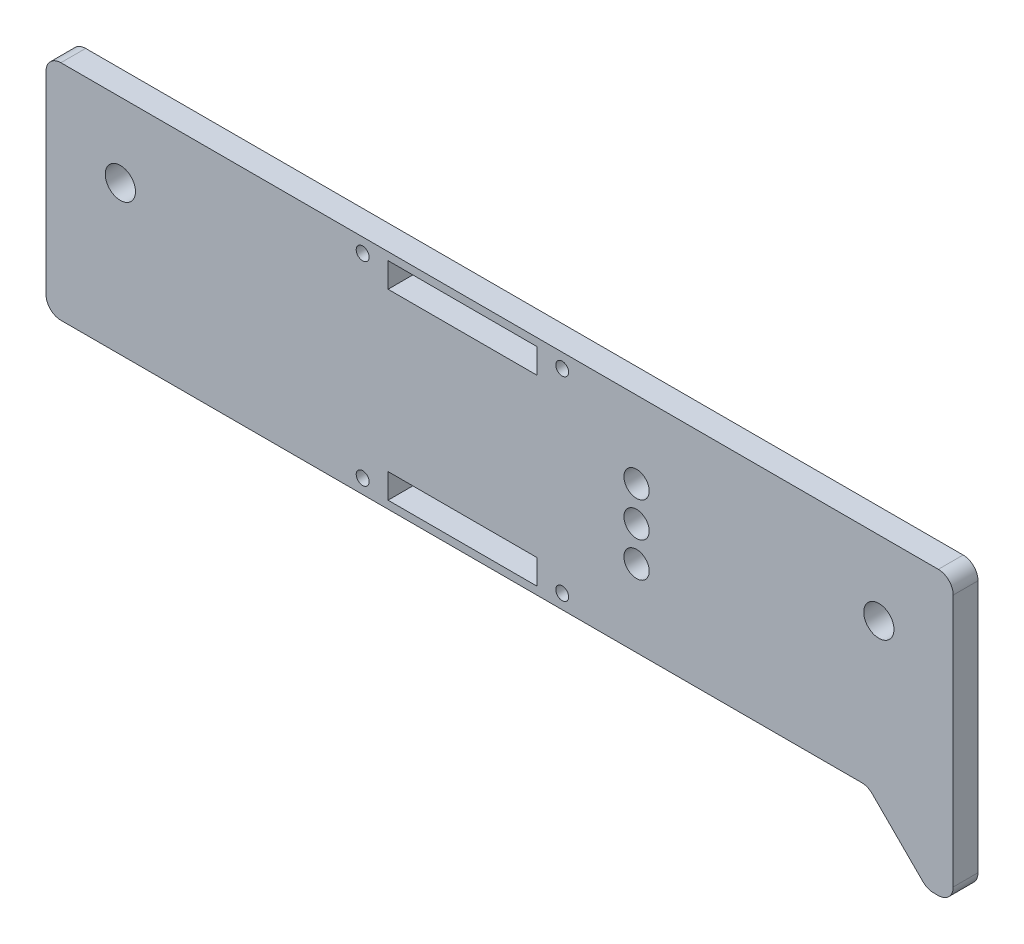
ISO-10303-21;
HEADER;
FILE_DESCRIPTION(('STEP AP214'),'2;1');
FILE_NAME('part.step','',(''),(''),'','','');
FILE_SCHEMA(('AUTOMOTIVE_DESIGN { 1 0 10303 214 1 1 1 1 }'));
ENDSEC;
DATA;
#1=APPLICATION_CONTEXT('core data for automotive mechanical design processes');
#2=APPLICATION_PROTOCOL_DEFINITION('international standard','automotive_design',2000,#1);
#3=PRODUCT_CONTEXT('',#1,'mechanical');
#4=PRODUCT('Part','Part','',(#3));
#5=PRODUCT_RELATED_PRODUCT_CATEGORY('part','',(#4));
#6=PRODUCT_DEFINITION_FORMATION('','',#4);
#7=PRODUCT_DEFINITION_CONTEXT('part definition',#1,'design');
#8=PRODUCT_DEFINITION('design','',#6,#7);
#9=PRODUCT_DEFINITION_SHAPE('','',#8);
#10=(LENGTH_UNIT() NAMED_UNIT(*) SI_UNIT(.MILLI.,.METRE.));
#11=(NAMED_UNIT(*) PLANE_ANGLE_UNIT() SI_UNIT($,.RADIAN.));
#12=(NAMED_UNIT(*) SI_UNIT($,.STERADIAN.) SOLID_ANGLE_UNIT());
#13=UNCERTAINTY_MEASURE_WITH_UNIT(LENGTH_MEASURE(1.E-05),#10,'distance_accuracy_value','');
#14=(GEOMETRIC_REPRESENTATION_CONTEXT(3) GLOBAL_UNCERTAINTY_ASSIGNED_CONTEXT((#13)) GLOBAL_UNIT_ASSIGNED_CONTEXT((#10,
#11,#12)) REPRESENTATION_CONTEXT('',''));
#15=CARTESIAN_POINT('',(0.,0.,0.));
#16=DIRECTION('',(0.,0.,1.));
#17=DIRECTION('',(1.,0.,0.));
#18=AXIS2_PLACEMENT_3D('',#15,#16,#17);
#19=CARTESIAN_POINT('',(0.,0.,5.));
#20=DIRECTION('',(0.,0.,1.));
#21=DIRECTION('',(1.,0.,0.));
#22=AXIS2_PLACEMENT_3D('',#19,#20,#21);
#23=PLANE('',#22);
#24=CARTESIAN_POINT('',(104.125,2.875,5.));
#25=DIRECTION('',(0.,0.,1.));
#26=DIRECTION('',(1.,0.,0.));
#27=AXIS2_PLACEMENT_3D('',#24,#25,#26);
#28=CIRCLE('',#27,1.30000000000001);
#29=CARTESIAN_POINT('',(105.425,2.875,5.));
#30=VERTEX_POINT('',#29);
#31=EDGE_CURVE('E250',#30,#30,#28,.T.);
#32=ORIENTED_EDGE('',*,*,#31,.F.);
#33=EDGE_LOOP('',(#32));
#34=FACE_BOUND('',#33,.T.);
#35=CARTESIAN_POINT('',(63.875,42.125,5.));
#36=DIRECTION('',(0.,0.,1.));
#37=DIRECTION('',(1.,0.,0.));
#38=AXIS2_PLACEMENT_3D('',#35,#36,#37);
#39=CIRCLE('',#38,1.29999999999999);
#40=CARTESIAN_POINT('',(65.175,42.125,5.));
#41=VERTEX_POINT('',#40);
#42=EDGE_CURVE('E262',#41,#41,#39,.T.);
#43=ORIENTED_EDGE('',*,*,#42,.F.);
#44=EDGE_LOOP('',(#43));
#45=FACE_BOUND('',#44,.T.);
#46=CARTESIAN_POINT('',(119.125,22.5,5.));
#47=DIRECTION('',(0.,0.,1.));
#48=DIRECTION('',(1.,0.,0.));
#49=AXIS2_PLACEMENT_3D('',#46,#47,#48);
#50=CIRCLE('',#49,2.54999999999999);
#51=CARTESIAN_POINT('',(121.675,22.5,5.));
#52=VERTEX_POINT('',#51);
#53=EDGE_CURVE('E274',#52,#52,#50,.T.);
#54=ORIENTED_EDGE('',*,*,#53,.F.);
#55=EDGE_LOOP('',(#54));
#56=FACE_BOUND('',#55,.T.);
#57=CARTESIAN_POINT('',(168.,30.,5.));
#58=DIRECTION('',(0.,0.,1.));
#59=DIRECTION('',(1.,0.,0.));
#60=AXIS2_PLACEMENT_3D('',#57,#58,#59);
#61=CIRCLE('',#60,3.04999999999999);
#62=CARTESIAN_POINT('',(171.05,30.,5.));
#63=VERTEX_POINT('',#62);
#64=EDGE_CURVE('E286',#63,#63,#61,.T.);
#65=ORIENTED_EDGE('',*,*,#64,.F.);
#66=EDGE_LOOP('',(#65));
#67=FACE_BOUND('',#66,.T.);
#68=DIRECTION('',(0.,1.,0.));
#69=VECTOR('',#68,1.);
#70=CARTESIAN_POINT('',(183.,-12.,5.));
#71=LINE('',#70,#69);
#72=CARTESIAN_POINT('',(183.,-8.99999999999998,5.));
#73=VERTEX_POINT('',#72);
#74=CARTESIAN_POINT('',(183.,42.,5.));
#75=VERTEX_POINT('',#74);
#76=EDGE_CURVE('E308',#73,#75,#71,.T.);
#77=ORIENTED_EDGE('',*,*,#76,.T.);
#78=CARTESIAN_POINT('',(180.,42.,5.));
#79=DIRECTION('',(0.,0.,1.));
#80=DIRECTION('',(1.,0.,0.));
#81=AXIS2_PLACEMENT_3D('',#78,#79,#80);
#82=CIRCLE('',#81,3.);
#83=CARTESIAN_POINT('',(180.,45.,5.));
#84=VERTEX_POINT('',#83);
#85=EDGE_CURVE('E357',#75,#84,#82,.T.);
#86=ORIENTED_EDGE('',*,*,#85,.T.);
#87=DIRECTION('',(-1.,0.,0.));
#88=VECTOR('',#87,1.);
#89=CARTESIAN_POINT('',(183.,45.,5.));
#90=LINE('',#89,#88);
#91=CARTESIAN_POINT('',(3.,45.,5.));
#92=VERTEX_POINT('',#91);
#93=EDGE_CURVE('E311',#84,#92,#90,.T.);
#94=ORIENTED_EDGE('',*,*,#93,.T.);
#95=CARTESIAN_POINT('',(3.,42.,5.));
#96=DIRECTION('',(0.,0.,1.));
#97=DIRECTION('',(1.,0.,0.));
#98=AXIS2_PLACEMENT_3D('',#95,#96,#97);
#99=CIRCLE('',#98,3.);
#100=CARTESIAN_POINT('',(0.,42.,5.));
#101=VERTEX_POINT('',#100);
#102=EDGE_CURVE('E55',#92,#101,#99,.T.);
#103=ORIENTED_EDGE('',*,*,#102,.T.);
#104=DIRECTION('',(0.,-1.,0.));
#105=VECTOR('',#104,1.);
#106=CARTESIAN_POINT('',(0.,45.,5.));
#107=LINE('',#106,#105);
#108=CARTESIAN_POINT('',(0.,3.00000000000002,5.));
#109=VERTEX_POINT('',#108);
#110=EDGE_CURVE('E313',#101,#109,#107,.T.);
#111=ORIENTED_EDGE('',*,*,#110,.T.);
#112=CARTESIAN_POINT('',(3.,3.,5.));
#113=DIRECTION('',(0.,0.,1.));
#114=DIRECTION('',(1.,0.,0.));
#115=AXIS2_PLACEMENT_3D('',#112,#113,#114);
#116=CIRCLE('',#115,3.);
#117=CARTESIAN_POINT('',(3.,0.,5.));
#118=VERTEX_POINT('',#117);
#119=EDGE_CURVE('E351',#109,#118,#116,.T.);
#120=ORIENTED_EDGE('',*,*,#119,.T.);
#121=DIRECTION('',(1.,0.,0.));
#122=VECTOR('',#121,1.);
#123=CARTESIAN_POINT('',(0.,0.,5.));
#124=LINE('',#123,#122);
#125=CARTESIAN_POINT('',(164.537359312881,0.,5.));
#126=VERTEX_POINT('',#125);
#127=EDGE_CURVE('E298',#118,#126,#124,.T.);
#128=ORIENTED_EDGE('',*,*,#127,.T.);
#129=CARTESIAN_POINT('',(164.537359312881,-3.,5.));
#130=DIRECTION('',(0.,0.,1.));
#131=DIRECTION('',(1.,0.,0.));
#132=AXIS2_PLACEMENT_3D('',#129,#130,#131);
#133=CIRCLE('',#132,3.);
#134=CARTESIAN_POINT('',(166.65867965644,-0.87867965644037,5.));
#135=VERTEX_POINT('',#134);
#136=EDGE_CURVE('E11',#126,#135,#133,.F.);
#137=ORIENTED_EDGE('',*,*,#136,.T.);
#138=DIRECTION('',(0.707106781186547,-0.707106781186548,0.));
#139=VECTOR('',#138,1.);
#140=CARTESIAN_POINT('',(165.78,0.,5.));
#141=LINE('',#140,#139);
#142=CARTESIAN_POINT('',(176.90132034356,-11.1213203435596,5.));
#143=VERTEX_POINT('',#142);
#144=EDGE_CURVE('E301',#135,#143,#141,.T.);
#145=ORIENTED_EDGE('',*,*,#144,.T.);
#146=CARTESIAN_POINT('',(179.022640687119,-8.99999999999998,5.));
#147=DIRECTION('',(0.,0.,1.));
#148=DIRECTION('',(1.,0.,0.));
#149=AXIS2_PLACEMENT_3D('',#146,#147,#148);
#150=CIRCLE('',#149,3.);
#151=CARTESIAN_POINT('',(179.022640687119,-12.,5.));
#152=VERTEX_POINT('',#151);
#153=EDGE_CURVE('E353',#143,#152,#150,.T.);
#154=ORIENTED_EDGE('',*,*,#153,.T.);
#155=DIRECTION('',(1.,0.,0.));
#156=VECTOR('',#155,1.);
#157=CARTESIAN_POINT('',(177.78,-12.,5.));
#158=LINE('',#157,#156);
#159=CARTESIAN_POINT('',(180.,-12.,5.));
#160=VERTEX_POINT('',#159);
#161=EDGE_CURVE('E305',#152,#160,#158,.T.);
#162=ORIENTED_EDGE('',*,*,#161,.T.);
#163=CARTESIAN_POINT('',(180.,-8.99999999999998,5.));
#164=DIRECTION('',(0.,0.,1.));
#165=DIRECTION('',(1.,0.,0.));
#166=AXIS2_PLACEMENT_3D('',#163,#164,#165);
#167=CIRCLE('',#166,3.);
#168=EDGE_CURVE('E355',#160,#73,#167,.T.);
#169=ORIENTED_EDGE('',*,*,#168,.T.);
#170=EDGE_LOOP('',(#77,#86,#94,#103,#111,#120,#128,#137,#145,#154,#162,#169));
#171=FACE_BOUND('',#170,.T.);
#172=CARTESIAN_POINT('',(15.,30.,5.));
#173=DIRECTION('',(0.,0.,1.));
#174=DIRECTION('',(1.,0.,0.));
#175=AXIS2_PLACEMENT_3D('',#172,#173,#174);
#176=CIRCLE('',#175,3.05);
#177=CARTESIAN_POINT('',(18.05,30.,5.));
#178=VERTEX_POINT('',#177);
#179=EDGE_CURVE('E292',#178,#178,#176,.T.);
#180=ORIENTED_EDGE('',*,*,#179,.F.);
#181=EDGE_LOOP('',(#180));
#182=FACE_BOUND('',#181,.T.);
#183=CARTESIAN_POINT('',(119.125,29.5,5.));
#184=DIRECTION('',(0.,0.,1.));
#185=DIRECTION('',(1.,0.,0.));
#186=AXIS2_PLACEMENT_3D('',#183,#184,#185);
#187=CIRCLE('',#186,2.54999999999999);
#188=CARTESIAN_POINT('',(121.675,29.5,5.));
#189=VERTEX_POINT('',#188);
#190=EDGE_CURVE('E280',#189,#189,#187,.T.);
#191=ORIENTED_EDGE('',*,*,#190,.F.);
#192=EDGE_LOOP('',(#191));
#193=FACE_BOUND('',#192,.T.);
#194=CARTESIAN_POINT('',(119.125,15.5,5.));
#195=DIRECTION('',(0.,0.,1.));
#196=DIRECTION('',(1.,0.,0.));
#197=AXIS2_PLACEMENT_3D('',#194,#195,#196);
#198=CIRCLE('',#197,2.54999999999999);
#199=CARTESIAN_POINT('',(121.675,15.5,5.));
#200=VERTEX_POINT('',#199);
#201=EDGE_CURVE('E268',#200,#200,#198,.T.);
#202=ORIENTED_EDGE('',*,*,#201,.F.);
#203=EDGE_LOOP('',(#202));
#204=FACE_BOUND('',#203,.T.);
#205=CARTESIAN_POINT('',(104.125,42.125,5.));
#206=DIRECTION('',(0.,0.,1.));
#207=DIRECTION('',(1.,0.,0.));
#208=AXIS2_PLACEMENT_3D('',#205,#206,#207);
#209=CIRCLE('',#208,1.30000000000001);
#210=CARTESIAN_POINT('',(105.425,42.125,5.));
#211=VERTEX_POINT('',#210);
#212=EDGE_CURVE('E256',#211,#211,#209,.T.);
#213=ORIENTED_EDGE('',*,*,#212,.F.);
#214=EDGE_LOOP('',(#213));
#215=FACE_BOUND('',#214,.T.);
#216=CARTESIAN_POINT('',(63.875,2.875,5.));
#217=DIRECTION('',(0.,0.,1.));
#218=DIRECTION('',(1.,0.,0.));
#219=AXIS2_PLACEMENT_3D('',#216,#217,#218);
#220=CIRCLE('',#219,1.29999999999999);
#221=CARTESIAN_POINT('',(65.175,2.875,5.));
#222=VERTEX_POINT('',#221);
#223=EDGE_CURVE('E244',#222,#222,#220,.T.);
#224=ORIENTED_EDGE('',*,*,#223,.F.);
#225=EDGE_LOOP('',(#224));
#226=FACE_BOUND('',#225,.T.);
#227=DIRECTION('',(1.,0.,0.));
#228=VECTOR('',#227,1.);
#229=CARTESIAN_POINT('',(69.,38.425,5.));
#230=LINE('',#229,#228);
#231=CARTESIAN_POINT('',(69.,38.425,5.));
#232=VERTEX_POINT('',#231);
#233=CARTESIAN_POINT('',(99.,38.425,5.));
#234=VERTEX_POINT('',#233);
#235=EDGE_CURVE('E215',#232,#234,#230,.T.);
#236=ORIENTED_EDGE('',*,*,#235,.F.);
#237=DIRECTION('',(0.,-1.,0.));
#238=VECTOR('',#237,1.);
#239=CARTESIAN_POINT('',(69.,43.425,5.));
#240=LINE('',#239,#238);
#241=CARTESIAN_POINT('',(69.,43.425,5.));
#242=VERTEX_POINT('',#241);
#243=EDGE_CURVE('E213',#242,#232,#240,.T.);
#244=ORIENTED_EDGE('',*,*,#243,.F.);
#245=DIRECTION('',(-1.,0.,0.));
#246=VECTOR('',#245,1.);
#247=CARTESIAN_POINT('',(69.,43.425,5.));
#248=LINE('',#247,#246);
#249=CARTESIAN_POINT('',(99.,43.425,5.));
#250=VERTEX_POINT('',#249);
#251=EDGE_CURVE('E221',#250,#242,#248,.T.);
#252=ORIENTED_EDGE('',*,*,#251,.F.);
#253=DIRECTION('',(0.,1.,0.));
#254=VECTOR('',#253,1.);
#255=CARTESIAN_POINT('',(99.,43.425,5.));
#256=LINE('',#255,#254);
#257=EDGE_CURVE('E218',#234,#250,#256,.T.);
#258=ORIENTED_EDGE('',*,*,#257,.F.);
#259=EDGE_LOOP('',(#236,#244,#252,#258));
#260=FACE_BOUND('',#259,.T.);
#261=DIRECTION('',(1.,0.,0.));
#262=VECTOR('',#261,1.);
#263=CARTESIAN_POINT('',(69.,1.57500000000001,5.));
#264=LINE('',#263,#262);
#265=CARTESIAN_POINT('',(69.,1.57500000000001,5.));
#266=VERTEX_POINT('',#265);
#267=CARTESIAN_POINT('',(99.,1.575,5.));
#268=VERTEX_POINT('',#267);
#269=EDGE_CURVE('E182',#266,#268,#264,.T.);
#270=ORIENTED_EDGE('',*,*,#269,.F.);
#271=DIRECTION('',(0.,-1.,0.));
#272=VECTOR('',#271,1.);
#273=CARTESIAN_POINT('',(69.,1.57500000000001,5.));
#274=LINE('',#273,#272);
#275=CARTESIAN_POINT('',(69.,6.575,5.));
#276=VERTEX_POINT('',#275);
#277=EDGE_CURVE('E172',#276,#266,#274,.T.);
#278=ORIENTED_EDGE('',*,*,#277,.F.);
#279=DIRECTION('',(-1.,0.,0.));
#280=VECTOR('',#279,1.);
#281=CARTESIAN_POINT('',(69.,6.575,5.));
#282=LINE('',#281,#280);
#283=CARTESIAN_POINT('',(99.,6.575,5.));
#284=VERTEX_POINT('',#283);
#285=EDGE_CURVE('E197',#284,#276,#282,.T.);
#286=ORIENTED_EDGE('',*,*,#285,.F.);
#287=DIRECTION('',(0.,1.,0.));
#288=VECTOR('',#287,1.);
#289=CARTESIAN_POINT('',(99.,1.575,5.));
#290=LINE('',#289,#288);
#291=EDGE_CURVE('E195',#268,#284,#290,.T.);
#292=ORIENTED_EDGE('',*,*,#291,.F.);
#293=EDGE_LOOP('',(#270,#278,#286,#292));
#294=FACE_BOUND('',#293,.T.);
#295=ADVANCED_FACE('F33',(#34,#45,#56,#67,#171,#182,#193,#204,#215,#226,#260,#294),#23,.T.);
#296=CARTESIAN_POINT('',(0.,0.,0.));
#297=DIRECTION('',(0.,0.,1.));
#298=DIRECTION('',(1.,0.,0.));
#299=AXIS2_PLACEMENT_3D('',#296,#297,#298);
#300=PLANE('',#299);
#301=DIRECTION('',(0.,-1.,0.));
#302=VECTOR('',#301,1.);
#303=CARTESIAN_POINT('',(69.,43.425,0.));
#304=LINE('',#303,#302);
#305=CARTESIAN_POINT('',(69.,43.425,0.));
#306=VERTEX_POINT('',#305);
#307=CARTESIAN_POINT('',(69.,38.425,0.));
#308=VERTEX_POINT('',#307);
#309=EDGE_CURVE('E190',#306,#308,#304,.T.);
#310=ORIENTED_EDGE('',*,*,#309,.T.);
#311=DIRECTION('',(1.,0.,0.));
#312=VECTOR('',#311,1.);
#313=CARTESIAN_POINT('',(69.,38.425,0.));
#314=LINE('',#313,#312);
#315=CARTESIAN_POINT('',(99.,38.425,0.));
#316=VERTEX_POINT('',#315);
#317=EDGE_CURVE('E226',#308,#316,#314,.T.);
#318=ORIENTED_EDGE('',*,*,#317,.T.);
#319=DIRECTION('',(0.,1.,0.));
#320=VECTOR('',#319,1.);
#321=CARTESIAN_POINT('',(99.,43.425,0.));
#322=LINE('',#321,#320);
#323=CARTESIAN_POINT('',(99.,43.425,0.));
#324=VERTEX_POINT('',#323);
#325=EDGE_CURVE('E229',#316,#324,#322,.T.);
#326=ORIENTED_EDGE('',*,*,#325,.T.);
#327=DIRECTION('',(-1.,0.,0.));
#328=VECTOR('',#327,1.);
#329=CARTESIAN_POINT('',(69.,43.425,0.));
#330=LINE('',#329,#328);
#331=EDGE_CURVE('E216',#324,#306,#330,.T.);
#332=ORIENTED_EDGE('',*,*,#331,.T.);
#333=EDGE_LOOP('',(#310,#318,#326,#332));
#334=FACE_BOUND('',#333,.T.);
#335=DIRECTION('',(-1.,0.,0.));
#336=VECTOR('',#335,1.);
#337=CARTESIAN_POINT('',(183.,45.,0.));
#338=LINE('',#337,#336);
#339=CARTESIAN_POINT('',(180.,45.,0.));
#340=VERTEX_POINT('',#339);
#341=CARTESIAN_POINT('',(3.,45.,0.));
#342=VERTEX_POINT('',#341);
#343=EDGE_CURVE('E327',#340,#342,#338,.T.);
#344=ORIENTED_EDGE('',*,*,#343,.F.);
#345=CARTESIAN_POINT('',(180.,42.,0.));
#346=DIRECTION('',(0.,0.,1.));
#347=DIRECTION('',(1.,0.,0.));
#348=AXIS2_PLACEMENT_3D('',#345,#346,#347);
#349=CIRCLE('',#348,3.);
#350=CARTESIAN_POINT('',(183.,42.,0.));
#351=VERTEX_POINT('',#350);
#352=EDGE_CURVE('E343',#340,#351,#349,.F.);
#353=ORIENTED_EDGE('',*,*,#352,.T.);
#354=DIRECTION('',(0.,1.,0.));
#355=VECTOR('',#354,1.);
#356=CARTESIAN_POINT('',(183.,-12.,0.));
#357=LINE('',#356,#355);
#358=CARTESIAN_POINT('',(183.,-8.99999999999998,0.));
#359=VERTEX_POINT('',#358);
#360=EDGE_CURVE('E324',#359,#351,#357,.T.);
#361=ORIENTED_EDGE('',*,*,#360,.F.);
#362=CARTESIAN_POINT('',(180.,-8.99999999999998,0.));
#363=DIRECTION('',(0.,0.,1.));
#364=DIRECTION('',(1.,0.,0.));
#365=AXIS2_PLACEMENT_3D('',#362,#363,#364);
#366=CIRCLE('',#365,3.);
#367=CARTESIAN_POINT('',(180.,-12.,0.));
#368=VERTEX_POINT('',#367);
#369=EDGE_CURVE('E341',#359,#368,#366,.F.);
#370=ORIENTED_EDGE('',*,*,#369,.T.);
#371=DIRECTION('',(1.,0.,0.));
#372=VECTOR('',#371,1.);
#373=CARTESIAN_POINT('',(177.78,-12.,0.));
#374=LINE('',#373,#372);
#375=CARTESIAN_POINT('',(179.022640687119,-12.,0.));
#376=VERTEX_POINT('',#375);
#377=EDGE_CURVE('E321',#376,#368,#374,.T.);
#378=ORIENTED_EDGE('',*,*,#377,.F.);
#379=CARTESIAN_POINT('',(179.022640687119,-8.99999999999998,0.));
#380=DIRECTION('',(0.,0.,1.));
#381=DIRECTION('',(1.,0.,0.));
#382=AXIS2_PLACEMENT_3D('',#379,#380,#381);
#383=CIRCLE('',#382,3.);
#384=CARTESIAN_POINT('',(176.90132034356,-11.1213203435596,0.));
#385=VERTEX_POINT('',#384);
#386=EDGE_CURVE('E339',#376,#385,#383,.F.);
#387=ORIENTED_EDGE('',*,*,#386,.T.);
#388=DIRECTION('',(0.707106781186547,-0.707106781186548,0.));
#389=VECTOR('',#388,1.);
#390=CARTESIAN_POINT('',(165.78,0.,0.));
#391=LINE('',#390,#389);
#392=CARTESIAN_POINT('',(166.65867965644,-0.87867965644037,0.));
#393=VERTEX_POINT('',#392);
#394=EDGE_CURVE('E318',#393,#385,#391,.T.);
#395=ORIENTED_EDGE('',*,*,#394,.F.);
#396=CARTESIAN_POINT('',(164.537359312881,-3.,0.));
#397=DIRECTION('',(0.,0.,1.));
#398=DIRECTION('',(1.,0.,0.));
#399=AXIS2_PLACEMENT_3D('',#396,#397,#398);
#400=CIRCLE('',#399,3.);
#401=CARTESIAN_POINT('',(164.537359312881,0.,0.));
#402=VERTEX_POINT('',#401);
#403=EDGE_CURVE('E41',#393,#402,#400,.T.);
#404=ORIENTED_EDGE('',*,*,#403,.T.);
#405=DIRECTION('',(1.,0.,0.));
#406=VECTOR('',#405,1.);
#407=CARTESIAN_POINT('',(0.,0.,0.));
#408=LINE('',#407,#406);
#409=CARTESIAN_POINT('',(3.,0.,0.));
#410=VERTEX_POINT('',#409);
#411=EDGE_CURVE('E295',#410,#402,#408,.T.);
#412=ORIENTED_EDGE('',*,*,#411,.F.);
#413=CARTESIAN_POINT('',(3.,3.,0.));
#414=DIRECTION('',(0.,0.,1.));
#415=DIRECTION('',(1.,0.,0.));
#416=AXIS2_PLACEMENT_3D('',#413,#414,#415);
#417=CIRCLE('',#416,3.);
#418=CARTESIAN_POINT('',(0.,3.00000000000002,0.));
#419=VERTEX_POINT('',#418);
#420=EDGE_CURVE('E337',#410,#419,#417,.F.);
#421=ORIENTED_EDGE('',*,*,#420,.T.);
#422=DIRECTION('',(0.,-1.,0.));
#423=VECTOR('',#422,1.);
#424=CARTESIAN_POINT('',(0.,45.,0.));
#425=LINE('',#424,#423);
#426=CARTESIAN_POINT('',(0.,42.,0.));
#427=VERTEX_POINT('',#426);
#428=EDGE_CURVE('E302',#427,#419,#425,.T.);
#429=ORIENTED_EDGE('',*,*,#428,.F.);
#430=CARTESIAN_POINT('',(3.,42.,0.));
#431=DIRECTION('',(0.,0.,1.));
#432=DIRECTION('',(1.,0.,0.));
#433=AXIS2_PLACEMENT_3D('',#430,#431,#432);
#434=CIRCLE('',#433,3.);
#435=EDGE_CURVE('E335',#427,#342,#434,.F.);
#436=ORIENTED_EDGE('',*,*,#435,.T.);
#437=EDGE_LOOP('',(#344,#353,#361,#370,#378,#387,#395,#404,#412,#421,#429,#436));
#438=FACE_BOUND('',#437,.T.);
#439=CARTESIAN_POINT('',(15.,30.,0.));
#440=DIRECTION('',(0.,0.,1.));
#441=DIRECTION('',(1.,0.,0.));
#442=AXIS2_PLACEMENT_3D('',#439,#440,#441);
#443=CIRCLE('',#442,3.05);
#444=CARTESIAN_POINT('',(18.05,30.,0.));
#445=VERTEX_POINT('',#444);
#446=EDGE_CURVE('E289',#445,#445,#443,.T.);
#447=ORIENTED_EDGE('',*,*,#446,.T.);
#448=EDGE_LOOP('',(#447));
#449=FACE_BOUND('',#448,.T.);
#450=CARTESIAN_POINT('',(168.,30.,0.));
#451=DIRECTION('',(0.,0.,1.));
#452=DIRECTION('',(1.,0.,0.));
#453=AXIS2_PLACEMENT_3D('',#450,#451,#452);
#454=CIRCLE('',#453,3.04999999999999);
#455=CARTESIAN_POINT('',(171.05,30.,0.));
#456=VERTEX_POINT('',#455);
#457=EDGE_CURVE('E283',#456,#456,#454,.T.);
#458=ORIENTED_EDGE('',*,*,#457,.T.);
#459=EDGE_LOOP('',(#458));
#460=FACE_BOUND('',#459,.T.);
#461=CARTESIAN_POINT('',(119.125,29.5,0.));
#462=DIRECTION('',(0.,0.,1.));
#463=DIRECTION('',(1.,0.,0.));
#464=AXIS2_PLACEMENT_3D('',#461,#462,#463);
#465=CIRCLE('',#464,2.54999999999999);
#466=CARTESIAN_POINT('',(121.675,29.5,0.));
#467=VERTEX_POINT('',#466);
#468=EDGE_CURVE('E277',#467,#467,#465,.T.);
#469=ORIENTED_EDGE('',*,*,#468,.T.);
#470=EDGE_LOOP('',(#469));
#471=FACE_BOUND('',#470,.T.);
#472=CARTESIAN_POINT('',(119.125,22.5,0.));
#473=DIRECTION('',(0.,0.,1.));
#474=DIRECTION('',(1.,0.,0.));
#475=AXIS2_PLACEMENT_3D('',#472,#473,#474);
#476=CIRCLE('',#475,2.54999999999999);
#477=CARTESIAN_POINT('',(121.675,22.5,0.));
#478=VERTEX_POINT('',#477);
#479=EDGE_CURVE('E271',#478,#478,#476,.T.);
#480=ORIENTED_EDGE('',*,*,#479,.T.);
#481=EDGE_LOOP('',(#480));
#482=FACE_BOUND('',#481,.T.);
#483=CARTESIAN_POINT('',(119.125,15.5,0.));
#484=DIRECTION('',(0.,0.,1.));
#485=DIRECTION('',(1.,0.,0.));
#486=AXIS2_PLACEMENT_3D('',#483,#484,#485);
#487=CIRCLE('',#486,2.54999999999999);
#488=CARTESIAN_POINT('',(121.675,15.5,0.));
#489=VERTEX_POINT('',#488);
#490=EDGE_CURVE('E265',#489,#489,#487,.T.);
#491=ORIENTED_EDGE('',*,*,#490,.T.);
#492=EDGE_LOOP('',(#491));
#493=FACE_BOUND('',#492,.T.);
#494=CARTESIAN_POINT('',(63.875,42.125,0.));
#495=DIRECTION('',(0.,0.,1.));
#496=DIRECTION('',(1.,0.,0.));
#497=AXIS2_PLACEMENT_3D('',#494,#495,#496);
#498=CIRCLE('',#497,1.29999999999999);
#499=CARTESIAN_POINT('',(65.175,42.125,0.));
#500=VERTEX_POINT('',#499);
#501=EDGE_CURVE('E259',#500,#500,#498,.T.);
#502=ORIENTED_EDGE('',*,*,#501,.T.);
#503=EDGE_LOOP('',(#502));
#504=FACE_BOUND('',#503,.T.);
#505=CARTESIAN_POINT('',(104.125,42.125,0.));
#506=DIRECTION('',(0.,0.,1.));
#507=DIRECTION('',(1.,0.,0.));
#508=AXIS2_PLACEMENT_3D('',#505,#506,#507);
#509=CIRCLE('',#508,1.30000000000001);
#510=CARTESIAN_POINT('',(105.425,42.125,0.));
#511=VERTEX_POINT('',#510);
#512=EDGE_CURVE('E253',#511,#511,#509,.T.);
#513=ORIENTED_EDGE('',*,*,#512,.T.);
#514=EDGE_LOOP('',(#513));
#515=FACE_BOUND('',#514,.T.);
#516=CARTESIAN_POINT('',(104.125,2.875,0.));
#517=DIRECTION('',(0.,0.,1.));
#518=DIRECTION('',(1.,0.,0.));
#519=AXIS2_PLACEMENT_3D('',#516,#517,#518);
#520=CIRCLE('',#519,1.30000000000001);
#521=CARTESIAN_POINT('',(105.425,2.875,0.));
#522=VERTEX_POINT('',#521);
#523=EDGE_CURVE('E247',#522,#522,#520,.T.);
#524=ORIENTED_EDGE('',*,*,#523,.T.);
#525=EDGE_LOOP('',(#524));
#526=FACE_BOUND('',#525,.T.);
#527=CARTESIAN_POINT('',(63.875,2.875,0.));
#528=DIRECTION('',(0.,0.,1.));
#529=DIRECTION('',(1.,0.,0.));
#530=AXIS2_PLACEMENT_3D('',#527,#528,#529);
#531=CIRCLE('',#530,1.29999999999999);
#532=CARTESIAN_POINT('',(65.175,2.875,0.));
#533=VERTEX_POINT('',#532);
#534=EDGE_CURVE('E243',#533,#533,#531,.T.);
#535=ORIENTED_EDGE('',*,*,#534,.T.);
#536=EDGE_LOOP('',(#535));
#537=FACE_BOUND('',#536,.T.);
#538=DIRECTION('',(0.,-1.,0.));
#539=VECTOR('',#538,1.);
#540=CARTESIAN_POINT('',(69.,1.57500000000001,0.));
#541=LINE('',#540,#539);
#542=CARTESIAN_POINT('',(69.,6.575,0.));
#543=VERTEX_POINT('',#542);
#544=CARTESIAN_POINT('',(69.,1.57500000000001,0.));
#545=VERTEX_POINT('',#544);
#546=EDGE_CURVE('E201',#543,#545,#541,.T.);
#547=ORIENTED_EDGE('',*,*,#546,.T.);
#548=DIRECTION('',(1.,0.,0.));
#549=VECTOR('',#548,1.);
#550=CARTESIAN_POINT('',(69.,1.57500000000001,0.));
#551=LINE('',#550,#549);
#552=CARTESIAN_POINT('',(99.,1.575,0.));
#553=VERTEX_POINT('',#552);
#554=EDGE_CURVE('E189',#545,#553,#551,.T.);
#555=ORIENTED_EDGE('',*,*,#554,.T.);
#556=DIRECTION('',(0.,1.,0.));
#557=VECTOR('',#556,1.);
#558=CARTESIAN_POINT('',(99.,1.575,0.));
#559=LINE('',#558,#557);
#560=CARTESIAN_POINT('',(99.,6.575,0.));
#561=VERTEX_POINT('',#560);
#562=EDGE_CURVE('E204',#553,#561,#559,.T.);
#563=ORIENTED_EDGE('',*,*,#562,.T.);
#564=DIRECTION('',(-1.,0.,0.));
#565=VECTOR('',#564,1.);
#566=CARTESIAN_POINT('',(69.,6.575,0.));
#567=LINE('',#566,#565);
#568=EDGE_CURVE('E183',#561,#543,#567,.T.);
#569=ORIENTED_EDGE('',*,*,#568,.T.);
#570=EDGE_LOOP('',(#547,#555,#563,#569));
#571=FACE_BOUND('',#570,.T.);
#572=ADVANCED_FACE('F381',(#334,#438,#449,#460,#471,#482,#493,#504,#515,#526,#537,#571),#300,.F.);
#573=CARTESIAN_POINT('',(0.,0.,5.));
#574=DIRECTION('',(0.,1.,0.));
#575=DIRECTION('',(0.,0.,1.));
#576=AXIS2_PLACEMENT_3D('',#573,#574,#575);
#577=PLANE('',#576);
#578=ORIENTED_EDGE('',*,*,#411,.T.);
#579=DIRECTION('',(0.,0.,-1.));
#580=VECTOR('',#579,1.);
#581=CARTESIAN_POINT('',(164.537359312881,0.,5.));
#582=LINE('',#581,#580);
#583=EDGE_CURVE('E372',#402,#126,#582,.F.);
#584=ORIENTED_EDGE('',*,*,#583,.T.);
#585=ORIENTED_EDGE('',*,*,#127,.F.);
#586=DIRECTION('',(0.,0.,-1.));
#587=VECTOR('',#586,1.);
#588=CARTESIAN_POINT('',(3.,0.,5.));
#589=LINE('',#588,#587);
#590=EDGE_CURVE('E369',#118,#410,#589,.T.);
#591=ORIENTED_EDGE('',*,*,#590,.T.);
#592=EDGE_LOOP('',(#578,#584,#585,#591));
#593=FACE_BOUND('',#592,.T.);
#594=ADVANCED_FACE('F387',(#593),#577,.F.);
#595=CARTESIAN_POINT('',(165.78,0.,5.));
#596=DIRECTION('',(0.707106781186548,0.707106781186547,0.));
#597=DIRECTION('',(-0.707106781186547,0.707106781186548,0.));
#598=AXIS2_PLACEMENT_3D('',#595,#596,#597);
#599=PLANE('',#598);
#600=ORIENTED_EDGE('',*,*,#394,.T.);
#601=DIRECTION('',(0.,0.,-1.));
#602=VECTOR('',#601,1.);
#603=CARTESIAN_POINT('',(176.90132034356,-11.1213203435596,5.));
#604=LINE('',#603,#602);
#605=EDGE_CURVE('E367',#385,#143,#604,.F.);
#606=ORIENTED_EDGE('',*,*,#605,.T.);
#607=ORIENTED_EDGE('',*,*,#144,.F.);
#608=DIRECTION('',(0.,0.,-1.));
#609=VECTOR('',#608,1.);
#610=CARTESIAN_POINT('',(166.65867965644,-0.87867965644037,0.));
#611=LINE('',#610,#609);
#612=EDGE_CURVE('E364',#135,#393,#611,.T.);
#613=ORIENTED_EDGE('',*,*,#612,.T.);
#614=EDGE_LOOP('',(#600,#606,#607,#613));
#615=FACE_BOUND('',#614,.T.);
#616=ADVANCED_FACE('F396',(#615),#599,.F.);
#617=CARTESIAN_POINT('',(177.78,-12.,5.));
#618=DIRECTION('',(0.,1.,0.));
#619=DIRECTION('',(-1.,0.,0.));
#620=AXIS2_PLACEMENT_3D('',#617,#618,#619);
#621=PLANE('',#620);
#622=ORIENTED_EDGE('',*,*,#377,.T.);
#623=DIRECTION('',(0.,0.,-1.));
#624=VECTOR('',#623,1.);
#625=CARTESIAN_POINT('',(180.,-12.,5.));
#626=LINE('',#625,#624);
#627=EDGE_CURVE('E362',#368,#160,#626,.F.);
#628=ORIENTED_EDGE('',*,*,#627,.T.);
#629=ORIENTED_EDGE('',*,*,#161,.F.);
#630=DIRECTION('',(0.,0.,-1.));
#631=VECTOR('',#630,1.);
#632=CARTESIAN_POINT('',(179.022640687119,-12.,5.));
#633=LINE('',#632,#631);
#634=EDGE_CURVE('E359',#152,#376,#633,.T.);
#635=ORIENTED_EDGE('',*,*,#634,.T.);
#636=EDGE_LOOP('',(#622,#628,#629,#635));
#637=FACE_BOUND('',#636,.T.);
#638=ADVANCED_FACE('F404',(#637),#621,.F.);
#639=CARTESIAN_POINT('',(183.,-12.,5.));
#640=DIRECTION('',(-1.,0.,0.));
#641=DIRECTION('',(0.,0.,1.));
#642=AXIS2_PLACEMENT_3D('',#639,#640,#641);
#643=PLANE('',#642);
#644=ORIENTED_EDGE('',*,*,#360,.T.);
#645=DIRECTION('',(0.,0.,-1.));
#646=VECTOR('',#645,1.);
#647=CARTESIAN_POINT('',(183.,42.,5.));
#648=LINE('',#647,#646);
#649=EDGE_CURVE('E348',#351,#75,#648,.F.);
#650=ORIENTED_EDGE('',*,*,#649,.T.);
#651=ORIENTED_EDGE('',*,*,#76,.F.);
#652=DIRECTION('',(0.,0.,-1.));
#653=VECTOR('',#652,1.);
#654=CARTESIAN_POINT('',(183.,-8.99999999999998,5.));
#655=LINE('',#654,#653);
#656=EDGE_CURVE('E345',#73,#359,#655,.T.);
#657=ORIENTED_EDGE('',*,*,#656,.T.);
#658=EDGE_LOOP('',(#644,#650,#651,#657));
#659=FACE_BOUND('',#658,.T.);
#660=ADVANCED_FACE('F413',(#659),#643,.F.);
#661=CARTESIAN_POINT('',(183.,45.,5.));
#662=DIRECTION('',(0.,-1.,0.));
#663=DIRECTION('',(1.,0.,0.));
#664=AXIS2_PLACEMENT_3D('',#661,#662,#663);
#665=PLANE('',#664);
#666=ORIENTED_EDGE('',*,*,#93,.F.);
#667=DIRECTION('',(0.,0.,-1.));
#668=VECTOR('',#667,1.);
#669=CARTESIAN_POINT('',(180.,45.,5.));
#670=LINE('',#669,#668);
#671=EDGE_CURVE('E332',#84,#340,#670,.T.);
#672=ORIENTED_EDGE('',*,*,#671,.T.);
#673=ORIENTED_EDGE('',*,*,#343,.T.);
#674=DIRECTION('',(0.,0.,-1.));
#675=VECTOR('',#674,1.);
#676=CARTESIAN_POINT('',(3.,45.,5.));
#677=LINE('',#676,#675);
#678=EDGE_CURVE('E315',#342,#92,#677,.F.);
#679=ORIENTED_EDGE('',*,*,#678,.T.);
#680=EDGE_LOOP('',(#666,#672,#673,#679));
#681=FACE_BOUND('',#680,.T.);
#682=ADVANCED_FACE('F421',(#681),#665,.F.);
#683=CARTESIAN_POINT('',(0.,45.,5.));
#684=DIRECTION('',(1.,0.,0.));
#685=DIRECTION('',(0.,1.,0.));
#686=AXIS2_PLACEMENT_3D('',#683,#684,#685);
#687=PLANE('',#686);
#688=ORIENTED_EDGE('',*,*,#428,.T.);
#689=DIRECTION('',(0.,0.,-1.));
#690=VECTOR('',#689,1.);
#691=CARTESIAN_POINT('',(0.,3.,5.));
#692=LINE('',#691,#690);
#693=EDGE_CURVE('E48',#419,#109,#692,.F.);
#694=ORIENTED_EDGE('',*,*,#693,.T.);
#695=ORIENTED_EDGE('',*,*,#110,.F.);
#696=DIRECTION('',(0.,0.,-1.));
#697=VECTOR('',#696,1.);
#698=CARTESIAN_POINT('',(0.,42.,5.));
#699=LINE('',#698,#697);
#700=EDGE_CURVE('E374',#101,#427,#699,.T.);
#701=ORIENTED_EDGE('',*,*,#700,.T.);
#702=EDGE_LOOP('',(#688,#694,#695,#701));
#703=FACE_BOUND('',#702,.T.);
#704=ADVANCED_FACE('F426',(#703),#687,.F.);
#705=CARTESIAN_POINT('',(15.,30.,5.));
#706=DIRECTION('',(0.,0.,-1.));
#707=DIRECTION('',(-1.,0.,0.));
#708=AXIS2_PLACEMENT_3D('',#705,#706,#707);
#709=CYLINDRICAL_SURFACE('',#708,3.05);
#710=ORIENTED_EDGE('',*,*,#179,.T.);
#711=EDGE_LOOP('',(#710));
#712=FACE_BOUND('',#711,.T.);
#713=ORIENTED_EDGE('',*,*,#446,.F.);
#714=EDGE_LOOP('',(#713));
#715=FACE_BOUND('',#714,.T.);
#716=ADVANCED_FACE('F447',(#712,#715),#709,.F.);
#717=CARTESIAN_POINT('',(168.,30.,5.));
#718=DIRECTION('',(0.,0.,-1.));
#719=DIRECTION('',(-1.,0.,0.));
#720=AXIS2_PLACEMENT_3D('',#717,#718,#719);
#721=CYLINDRICAL_SURFACE('',#720,3.04999999999999);
#722=ORIENTED_EDGE('',*,*,#64,.T.);
#723=EDGE_LOOP('',(#722));
#724=FACE_BOUND('',#723,.T.);
#725=ORIENTED_EDGE('',*,*,#457,.F.);
#726=EDGE_LOOP('',(#725));
#727=FACE_BOUND('',#726,.T.);
#728=ADVANCED_FACE('F630',(#724,#727),#721,.F.);
#729=CARTESIAN_POINT('',(119.125,29.5,5.));
#730=DIRECTION('',(0.,0.,-1.));
#731=DIRECTION('',(-1.,0.,0.));
#732=AXIS2_PLACEMENT_3D('',#729,#730,#731);
#733=CYLINDRICAL_SURFACE('',#732,2.54999999999999);
#734=ORIENTED_EDGE('',*,*,#190,.T.);
#735=EDGE_LOOP('',(#734));
#736=FACE_BOUND('',#735,.T.);
#737=ORIENTED_EDGE('',*,*,#468,.F.);
#738=EDGE_LOOP('',(#737));
#739=FACE_BOUND('',#738,.T.);
#740=ADVANCED_FACE('F621',(#736,#739),#733,.F.);
#741=CARTESIAN_POINT('',(119.125,22.5,5.));
#742=DIRECTION('',(0.,0.,-1.));
#743=DIRECTION('',(-1.,0.,0.));
#744=AXIS2_PLACEMENT_3D('',#741,#742,#743);
#745=CYLINDRICAL_SURFACE('',#744,2.54999999999999);
#746=ORIENTED_EDGE('',*,*,#53,.T.);
#747=EDGE_LOOP('',(#746));
#748=FACE_BOUND('',#747,.T.);
#749=ORIENTED_EDGE('',*,*,#479,.F.);
#750=EDGE_LOOP('',(#749));
#751=FACE_BOUND('',#750,.T.);
#752=ADVANCED_FACE('F612',(#748,#751),#745,.F.);
#753=CARTESIAN_POINT('',(119.125,15.5,5.));
#754=DIRECTION('',(0.,0.,-1.));
#755=DIRECTION('',(-1.,0.,0.));
#756=AXIS2_PLACEMENT_3D('',#753,#754,#755);
#757=CYLINDRICAL_SURFACE('',#756,2.54999999999999);
#758=ORIENTED_EDGE('',*,*,#201,.T.);
#759=EDGE_LOOP('',(#758));
#760=FACE_BOUND('',#759,.T.);
#761=ORIENTED_EDGE('',*,*,#490,.F.);
#762=EDGE_LOOP('',(#761));
#763=FACE_BOUND('',#762,.T.);
#764=ADVANCED_FACE('F603',(#760,#763),#757,.F.);
#765=CARTESIAN_POINT('',(63.875,42.125,5.));
#766=DIRECTION('',(0.,0.,-1.));
#767=DIRECTION('',(-1.,0.,0.));
#768=AXIS2_PLACEMENT_3D('',#765,#766,#767);
#769=CYLINDRICAL_SURFACE('',#768,1.29999999999999);
#770=ORIENTED_EDGE('',*,*,#42,.T.);
#771=EDGE_LOOP('',(#770));
#772=FACE_BOUND('',#771,.T.);
#773=ORIENTED_EDGE('',*,*,#501,.F.);
#774=EDGE_LOOP('',(#773));
#775=FACE_BOUND('',#774,.T.);
#776=ADVANCED_FACE('F594',(#772,#775),#769,.F.);
#777=CARTESIAN_POINT('',(104.125,42.125,5.));
#778=DIRECTION('',(0.,0.,-1.));
#779=DIRECTION('',(-1.,0.,0.));
#780=AXIS2_PLACEMENT_3D('',#777,#778,#779);
#781=CYLINDRICAL_SURFACE('',#780,1.30000000000001);
#782=ORIENTED_EDGE('',*,*,#212,.T.);
#783=EDGE_LOOP('',(#782));
#784=FACE_BOUND('',#783,.T.);
#785=ORIENTED_EDGE('',*,*,#512,.F.);
#786=EDGE_LOOP('',(#785));
#787=FACE_BOUND('',#786,.T.);
#788=ADVANCED_FACE('F585',(#784,#787),#781,.F.);
#789=CARTESIAN_POINT('',(104.125,2.875,5.));
#790=DIRECTION('',(0.,0.,-1.));
#791=DIRECTION('',(-1.,0.,0.));
#792=AXIS2_PLACEMENT_3D('',#789,#790,#791);
#793=CYLINDRICAL_SURFACE('',#792,1.30000000000001);
#794=ORIENTED_EDGE('',*,*,#31,.T.);
#795=EDGE_LOOP('',(#794));
#796=FACE_BOUND('',#795,.T.);
#797=ORIENTED_EDGE('',*,*,#523,.F.);
#798=EDGE_LOOP('',(#797));
#799=FACE_BOUND('',#798,.T.);
#800=ADVANCED_FACE('F576',(#796,#799),#793,.F.);
#801=CARTESIAN_POINT('',(63.875,2.875,5.));
#802=DIRECTION('',(0.,0.,-1.));
#803=DIRECTION('',(-1.,0.,0.));
#804=AXIS2_PLACEMENT_3D('',#801,#802,#803);
#805=CYLINDRICAL_SURFACE('',#804,1.29999999999999);
#806=ORIENTED_EDGE('',*,*,#223,.T.);
#807=EDGE_LOOP('',(#806));
#808=FACE_BOUND('',#807,.T.);
#809=ORIENTED_EDGE('',*,*,#534,.F.);
#810=EDGE_LOOP('',(#809));
#811=FACE_BOUND('',#810,.T.);
#812=ADVANCED_FACE('F567',(#808,#811),#805,.F.);
#813=CARTESIAN_POINT('',(69.,43.425,5.));
#814=DIRECTION('',(1.,0.,0.));
#815=DIRECTION('',(0.,1.,0.));
#816=AXIS2_PLACEMENT_3D('',#813,#814,#815);
#817=PLANE('',#816);
#818=ORIENTED_EDGE('',*,*,#309,.F.);
#819=DIRECTION('',(0.,0.,-1.));
#820=VECTOR('',#819,1.);
#821=CARTESIAN_POINT('',(69.,43.425,5.));
#822=LINE('',#821,#820);
#823=EDGE_CURVE('E223',#242,#306,#822,.T.);
#824=ORIENTED_EDGE('',*,*,#823,.F.);
#825=ORIENTED_EDGE('',*,*,#243,.T.);
#826=DIRECTION('',(0.,0.,-1.));
#827=VECTOR('',#826,1.);
#828=CARTESIAN_POINT('',(69.,38.425,5.));
#829=LINE('',#828,#827);
#830=EDGE_CURVE('E240',#232,#308,#829,.T.);
#831=ORIENTED_EDGE('',*,*,#830,.T.);
#832=EDGE_LOOP('',(#818,#824,#825,#831));
#833=FACE_BOUND('',#832,.T.);
#834=ADVANCED_FACE('F558',(#833),#817,.T.);
#835=CARTESIAN_POINT('',(69.,38.425,5.));
#836=DIRECTION('',(0.,1.,0.));
#837=DIRECTION('',(0.,0.,1.));
#838=AXIS2_PLACEMENT_3D('',#835,#836,#837);
#839=PLANE('',#838);
#840=ORIENTED_EDGE('',*,*,#317,.F.);
#841=ORIENTED_EDGE('',*,*,#830,.F.);
#842=ORIENTED_EDGE('',*,*,#235,.T.);
#843=DIRECTION('',(0.,0.,-1.));
#844=VECTOR('',#843,1.);
#845=CARTESIAN_POINT('',(99.,38.425,5.));
#846=LINE('',#845,#844);
#847=EDGE_CURVE('E238',#234,#316,#846,.T.);
#848=ORIENTED_EDGE('',*,*,#847,.T.);
#849=EDGE_LOOP('',(#840,#841,#842,#848));
#850=FACE_BOUND('',#849,.T.);
#851=ADVANCED_FACE('F549',(#850),#839,.T.);
#852=CARTESIAN_POINT('',(99.,43.425,5.));
#853=DIRECTION('',(-1.,0.,0.));
#854=DIRECTION('',(0.,-1.,0.));
#855=AXIS2_PLACEMENT_3D('',#852,#853,#854);
#856=PLANE('',#855);
#857=ORIENTED_EDGE('',*,*,#325,.F.);
#858=ORIENTED_EDGE('',*,*,#847,.F.);
#859=ORIENTED_EDGE('',*,*,#257,.T.);
#860=DIRECTION('',(0.,0.,-1.));
#861=VECTOR('',#860,1.);
#862=CARTESIAN_POINT('',(99.,43.425,5.));
#863=LINE('',#862,#861);
#864=EDGE_CURVE('E236',#250,#324,#863,.T.);
#865=ORIENTED_EDGE('',*,*,#864,.T.);
#866=EDGE_LOOP('',(#857,#858,#859,#865));
#867=FACE_BOUND('',#866,.T.);
#868=ADVANCED_FACE('F540',(#867),#856,.T.);
#869=CARTESIAN_POINT('',(69.,43.425,5.));
#870=DIRECTION('',(0.,-1.,0.));
#871=DIRECTION('',(0.,0.,-1.));
#872=AXIS2_PLACEMENT_3D('',#869,#870,#871);
#873=PLANE('',#872);
#874=ORIENTED_EDGE('',*,*,#331,.F.);
#875=ORIENTED_EDGE('',*,*,#864,.F.);
#876=ORIENTED_EDGE('',*,*,#251,.T.);
#877=ORIENTED_EDGE('',*,*,#823,.T.);
#878=EDGE_LOOP('',(#874,#875,#876,#877));
#879=FACE_BOUND('',#878,.T.);
#880=ADVANCED_FACE('F532',(#879),#873,.T.);
#881=CARTESIAN_POINT('',(69.,1.57500000000001,5.));
#882=DIRECTION('',(1.,0.,0.));
#883=DIRECTION('',(0.,1.,0.));
#884=AXIS2_PLACEMENT_3D('',#881,#882,#883);
#885=PLANE('',#884);
#886=ORIENTED_EDGE('',*,*,#546,.F.);
#887=DIRECTION('',(0.,0.,-1.));
#888=VECTOR('',#887,1.);
#889=CARTESIAN_POINT('',(69.,6.575,5.));
#890=LINE('',#889,#888);
#891=EDGE_CURVE('E178',#276,#543,#890,.T.);
#892=ORIENTED_EDGE('',*,*,#891,.F.);
#893=ORIENTED_EDGE('',*,*,#277,.T.);
#894=DIRECTION('',(0.,0.,-1.));
#895=VECTOR('',#894,1.);
#896=CARTESIAN_POINT('',(69.,1.57500000000001,5.));
#897=LINE('',#896,#895);
#898=EDGE_CURVE('E175',#266,#545,#897,.T.);
#899=ORIENTED_EDGE('',*,*,#898,.T.);
#900=EDGE_LOOP('',(#886,#892,#893,#899));
#901=FACE_BOUND('',#900,.T.);
#902=ADVANCED_FACE('F174',(#901),#885,.T.);
#903=CARTESIAN_POINT('',(69.,1.57500000000001,5.));
#904=DIRECTION('',(0.,1.,0.));
#905=DIRECTION('',(-1.,0.,0.));
#906=AXIS2_PLACEMENT_3D('',#903,#904,#905);
#907=PLANE('',#906);
#908=ORIENTED_EDGE('',*,*,#554,.F.);
#909=ORIENTED_EDGE('',*,*,#898,.F.);
#910=ORIENTED_EDGE('',*,*,#269,.T.);
#911=DIRECTION('',(0.,0.,-1.));
#912=VECTOR('',#911,1.);
#913=CARTESIAN_POINT('',(99.,1.575,5.));
#914=LINE('',#913,#912);
#915=EDGE_CURVE('E191',#268,#553,#914,.T.);
#916=ORIENTED_EDGE('',*,*,#915,.T.);
#917=EDGE_LOOP('',(#908,#909,#910,#916));
#918=FACE_BOUND('',#917,.T.);
#919=ADVANCED_FACE('F186',(#918),#907,.T.);
#920=CARTESIAN_POINT('',(99.,1.575,5.));
#921=DIRECTION('',(-1.,0.,0.));
#922=DIRECTION('',(0.,-1.,0.));
#923=AXIS2_PLACEMENT_3D('',#920,#921,#922);
#924=PLANE('',#923);
#925=ORIENTED_EDGE('',*,*,#562,.F.);
#926=ORIENTED_EDGE('',*,*,#915,.F.);
#927=ORIENTED_EDGE('',*,*,#291,.T.);
#928=DIRECTION('',(0.,0.,-1.));
#929=VECTOR('',#928,1.);
#930=CARTESIAN_POINT('',(99.,6.575,5.));
#931=LINE('',#930,#929);
#932=EDGE_CURVE('E210',#284,#561,#931,.T.);
#933=ORIENTED_EDGE('',*,*,#932,.T.);
#934=EDGE_LOOP('',(#925,#926,#927,#933));
#935=FACE_BOUND('',#934,.T.);
#936=ADVANCED_FACE('F508',(#935),#924,.T.);
#937=CARTESIAN_POINT('',(69.,6.575,5.));
#938=DIRECTION('',(0.,-1.,0.));
#939=DIRECTION('',(1.,0.,0.));
#940=AXIS2_PLACEMENT_3D('',#937,#938,#939);
#941=PLANE('',#940);
#942=ORIENTED_EDGE('',*,*,#568,.F.);
#943=ORIENTED_EDGE('',*,*,#932,.F.);
#944=ORIENTED_EDGE('',*,*,#285,.T.);
#945=ORIENTED_EDGE('',*,*,#891,.T.);
#946=EDGE_LOOP('',(#942,#943,#944,#945));
#947=FACE_BOUND('',#946,.T.);
#948=ADVANCED_FACE('F464',(#947),#941,.T.);
#949=CARTESIAN_POINT('',(180.,42.,5.));
#950=DIRECTION('',(0.,0.,-1.));
#951=DIRECTION('',(-1.,0.,0.));
#952=AXIS2_PLACEMENT_3D('',#949,#950,#951);
#953=CYLINDRICAL_SURFACE('',#952,3.);
#954=ORIENTED_EDGE('',*,*,#85,.F.);
#955=ORIENTED_EDGE('',*,*,#649,.F.);
#956=ORIENTED_EDGE('',*,*,#352,.F.);
#957=ORIENTED_EDGE('',*,*,#671,.F.);
#958=EDGE_LOOP('',(#954,#955,#956,#957));
#959=FACE_BOUND('',#958,.T.);
#960=ADVANCED_FACE('F417',(#959),#953,.T.);
#961=CARTESIAN_POINT('',(180.,-8.99999999999998,5.));
#962=DIRECTION('',(0.,0.,-1.));
#963=DIRECTION('',(-1.,0.,0.));
#964=AXIS2_PLACEMENT_3D('',#961,#962,#963);
#965=CYLINDRICAL_SURFACE('',#964,3.);
#966=ORIENTED_EDGE('',*,*,#168,.F.);
#967=ORIENTED_EDGE('',*,*,#627,.F.);
#968=ORIENTED_EDGE('',*,*,#369,.F.);
#969=ORIENTED_EDGE('',*,*,#656,.F.);
#970=EDGE_LOOP('',(#966,#967,#968,#969));
#971=FACE_BOUND('',#970,.T.);
#972=ADVANCED_FACE('F408',(#971),#965,.T.);
#973=CARTESIAN_POINT('',(179.022640687119,-8.99999999999998,5.));
#974=DIRECTION('',(0.,0.,-1.));
#975=DIRECTION('',(-1.,0.,0.));
#976=AXIS2_PLACEMENT_3D('',#973,#974,#975);
#977=CYLINDRICAL_SURFACE('',#976,3.);
#978=ORIENTED_EDGE('',*,*,#153,.F.);
#979=ORIENTED_EDGE('',*,*,#605,.F.);
#980=ORIENTED_EDGE('',*,*,#386,.F.);
#981=ORIENTED_EDGE('',*,*,#634,.F.);
#982=EDGE_LOOP('',(#978,#979,#980,#981));
#983=FACE_BOUND('',#982,.T.);
#984=ADVANCED_FACE('F399',(#983),#977,.T.);
#985=CARTESIAN_POINT('',(164.537359312881,-3.,5.));
#986=DIRECTION('',(0.,0.,1.));
#987=DIRECTION('',(1.,0.,0.));
#988=AXIS2_PLACEMENT_3D('',#985,#986,#987);
#989=CYLINDRICAL_SURFACE('',#988,3.);
#990=ORIENTED_EDGE('',*,*,#136,.F.);
#991=ORIENTED_EDGE('',*,*,#583,.F.);
#992=ORIENTED_EDGE('',*,*,#403,.F.);
#993=ORIENTED_EDGE('',*,*,#612,.F.);
#994=EDGE_LOOP('',(#990,#991,#992,#993));
#995=FACE_BOUND('',#994,.T.);
#996=ADVANCED_FACE('F391',(#995),#989,.F.);
#997=CARTESIAN_POINT('',(3.,3.,5.));
#998=DIRECTION('',(0.,0.,-1.));
#999=DIRECTION('',(-1.,0.,0.));
#1000=AXIS2_PLACEMENT_3D('',#997,#998,#999);
#1001=CYLINDRICAL_SURFACE('',#1000,3.);
#1002=ORIENTED_EDGE('',*,*,#119,.F.);
#1003=ORIENTED_EDGE('',*,*,#693,.F.);
#1004=ORIENTED_EDGE('',*,*,#420,.F.);
#1005=ORIENTED_EDGE('',*,*,#590,.F.);
#1006=EDGE_LOOP('',(#1002,#1003,#1004,#1005));
#1007=FACE_BOUND('',#1006,.T.);
#1008=ADVANCED_FACE('F429',(#1007),#1001,.T.);
#1009=CARTESIAN_POINT('',(3.,42.,5.));
#1010=DIRECTION('',(0.,0.,-1.));
#1011=DIRECTION('',(-1.,0.,0.));
#1012=AXIS2_PLACEMENT_3D('',#1009,#1010,#1011);
#1013=CYLINDRICAL_SURFACE('',#1012,3.);
#1014=ORIENTED_EDGE('',*,*,#102,.F.);
#1015=ORIENTED_EDGE('',*,*,#678,.F.);
#1016=ORIENTED_EDGE('',*,*,#435,.F.);
#1017=ORIENTED_EDGE('',*,*,#700,.F.);
#1018=EDGE_LOOP('',(#1014,#1015,#1016,#1017));
#1019=FACE_BOUND('',#1018,.T.);
#1020=ADVANCED_FACE('F35',(#1019),#1013,.T.);
#1021=CLOSED_SHELL('',(#295,#572,#594,#616,#638,#660,#682,#704,#716,#728,#740,#752,#764,#776,
#788,#800,#812,#834,#851,#868,#880,#902,#919,#936,#948,#960,#972,#984,#996,#1008,#1020));
#1022=MANIFOLD_SOLID_BREP('B2',#1021);
#1023=ADVANCED_BREP_SHAPE_REPRESENTATION('',(#18,#1022),#14);
#1024=SHAPE_DEFINITION_REPRESENTATION(#9,#1023);
ENDSEC;
END-ISO-10303-21;
